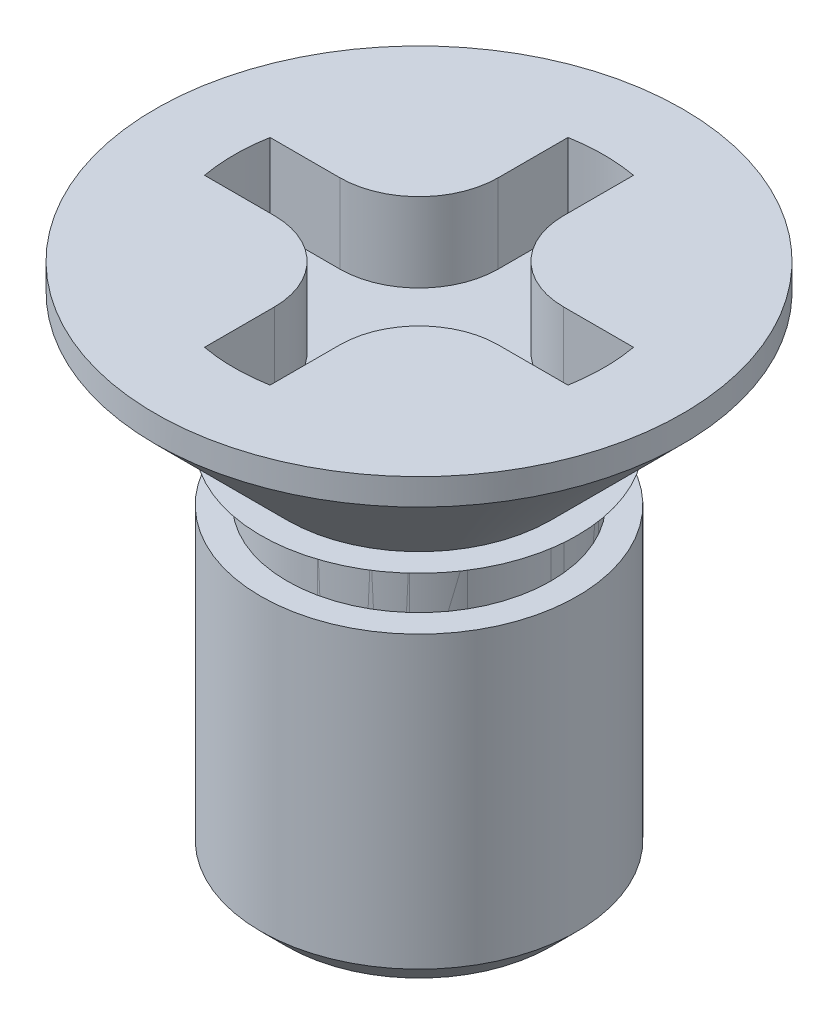
ISO-10303-21;
HEADER;
FILE_DESCRIPTION(('STEP AP214'),'2;1');
FILE_NAME('part.step','',(''),(''),'','','');
FILE_SCHEMA(('AUTOMOTIVE_DESIGN { 1 0 10303 214 1 1 1 1 }'));
ENDSEC;
DATA;
#1=APPLICATION_CONTEXT('core data for automotive mechanical design processes');
#2=APPLICATION_PROTOCOL_DEFINITION('international standard','automotive_design',2000,#1);
#3=PRODUCT_CONTEXT('',#1,'mechanical');
#4=PRODUCT('Part','Part','',(#3));
#5=PRODUCT_RELATED_PRODUCT_CATEGORY('part','',(#4));
#6=PRODUCT_DEFINITION_FORMATION('','',#4);
#7=PRODUCT_DEFINITION_CONTEXT('part definition',#1,'design');
#8=PRODUCT_DEFINITION('design','',#6,#7);
#9=PRODUCT_DEFINITION_SHAPE('','',#8);
#10=(LENGTH_UNIT() NAMED_UNIT(*) SI_UNIT(.MILLI.,.METRE.));
#11=(NAMED_UNIT(*) PLANE_ANGLE_UNIT() SI_UNIT($,.RADIAN.));
#12=(NAMED_UNIT(*) SI_UNIT($,.STERADIAN.) SOLID_ANGLE_UNIT());
#13=UNCERTAINTY_MEASURE_WITH_UNIT(LENGTH_MEASURE(1.E-05),#10,'distance_accuracy_value','');
#14=(GEOMETRIC_REPRESENTATION_CONTEXT(3) GLOBAL_UNCERTAINTY_ASSIGNED_CONTEXT((#13)) GLOBAL_UNIT_ASSIGNED_CONTEXT((#10,
#11,#12)) REPRESENTATION_CONTEXT('',''));
#15=CARTESIAN_POINT('',(0.,0.,0.));
#16=DIRECTION('',(0.,0.,1.));
#17=DIRECTION('',(1.,0.,0.));
#18=AXIS2_PLACEMENT_3D('',#15,#16,#17);
#19=CARTESIAN_POINT('',(0.,-3.5,0.));
#20=DIRECTION('',(0.,1.,0.));
#21=DIRECTION('',(0.,0.,1.));
#22=AXIS2_PLACEMENT_3D('',#19,#20,#21);
#23=CYLINDRICAL_SURFACE('',#22,1.25);
#24=CARTESIAN_POINT('',(0.,0.,0.));
#25=DIRECTION('',(0.,1.,0.));
#26=DIRECTION('',(0.,0.,1.));
#27=AXIS2_PLACEMENT_3D('',#24,#25,#26);
#28=CIRCLE('',#27,1.25);
#29=CARTESIAN_POINT('',(0.,0.,1.25));
#30=VERTEX_POINT('',#29);
#31=EDGE_CURVE('P0_E20',#30,#30,#28,.F.);
#32=ORIENTED_EDGE('',*,*,#31,.T.);
#33=EDGE_LOOP('',(#32));
#34=FACE_BOUND('',#33,.T.);
#35=CARTESIAN_POINT('',(0.,-3.5,0.));
#36=DIRECTION('',(0.,1.,0.));
#37=DIRECTION('',(0.,0.,1.));
#38=AXIS2_PLACEMENT_3D('',#35,#36,#37);
#39=CIRCLE('',#38,1.25);
#40=CARTESIAN_POINT('',(0.,-3.5,1.25));
#41=VERTEX_POINT('',#40);
#42=EDGE_CURVE('P0_E11',#41,#41,#39,.T.);
#43=ORIENTED_EDGE('',*,*,#42,.T.);
#44=EDGE_LOOP('',(#43));
#45=FACE_BOUND('',#44,.T.);
#46=ADVANCED_FACE('P0_F16',(#34,#45),#23,.T.);
#47=CARTESIAN_POINT('',(0.,0.,0.));
#48=DIRECTION('',(0.,1.,0.));
#49=DIRECTION('',(0.,0.,1.));
#50=AXIS2_PLACEMENT_3D('',#47,#48,#49);
#51=PLANE('',#50);
#52=ORIENTED_EDGE('',*,*,#31,.F.);
#53=EDGE_LOOP('',(#52));
#54=FACE_BOUND('',#53,.T.);
#55=CARTESIAN_POINT('',(-1.5,0.,0.));
#56=CARTESIAN_POINT('',(-1.5,0.,0.285847582881003));
#57=CARTESIAN_POINT('',(-1.39468245159365,0.,0.552142064342809));
#58=CARTESIAN_POINT('',(-1.28062366104029,0.,0.840538698580573));
#59=CARTESIAN_POINT('',(-1.06066017177982,0.,1.06066017177982));
#60=CARTESIAN_POINT('',(-0.841441605257595,0.,1.28003618721645));
#61=CARTESIAN_POINT('',(-0.552142064342809,0.,1.39468245159365));
#62=CARTESIAN_POINT('',(-0.286638464369077,0.,1.49989864315564));
#63=CARTESIAN_POINT('',(0.,0.,1.5));
#64=CARTESIAN_POINT('',(0.285592238421834,0.,1.50010098689345));
#65=CARTESIAN_POINT('',(0.552142064342809,0.,1.39468245159365));
#66=CARTESIAN_POINT('',(0.840538698580596,0.,1.28062366104033));
#67=CARTESIAN_POINT('',(1.06066017177982,0.,1.06066017177982));
#68=CARTESIAN_POINT('',(1.28003618721649,0.,0.841441605257491));
#69=CARTESIAN_POINT('',(1.39468245159365,0.,0.552142064342809));
#70=CARTESIAN_POINT('',(1.5,0.,0.286382699484786));
#71=CARTESIAN_POINT('',(1.5,0.,0.));
#72=B_SPLINE_CURVE_WITH_KNOTS('',2,(#55,#56,#57,#58,#59,#60,#61,#62,#63,#64,#65,#66,#67,#68,#69,
#70,#71),.UNSPECIFIED.,.F.,.F.,(3,2,2,2,2,2,2,2,3),(0.,0.125,0.25,0.375,0.5,0.625,0.75,0.875,
1.),.UNSPECIFIED.);
#73=CARTESIAN_POINT('',(-1.5,0.,0.));
#74=VERTEX_POINT('',#73);
#75=CARTESIAN_POINT('',(1.5,0.,0.));
#76=VERTEX_POINT('',#75);
#77=EDGE_CURVE('P0_E28',#74,#76,#72,.T.);
#78=ORIENTED_EDGE('',*,*,#77,.F.);
#79=CARTESIAN_POINT('',(1.5,0.,0.));
#80=CARTESIAN_POINT('',(1.5,0.,-0.285847582881003));
#81=CARTESIAN_POINT('',(1.39468245159365,0.,-0.552142064342809));
#82=CARTESIAN_POINT('',(1.28062366104029,0.,-0.840538698580573));
#83=CARTESIAN_POINT('',(1.06066017177982,0.,-1.06066017177982));
#84=CARTESIAN_POINT('',(0.841441605257595,0.,-1.28003618721645));
#85=CARTESIAN_POINT('',(0.552142064342809,0.,-1.39468245159365));
#86=CARTESIAN_POINT('',(0.286638464369077,0.,-1.49989864315564));
#87=CARTESIAN_POINT('',(0.,0.,-1.5));
#88=CARTESIAN_POINT('',(-0.285592238421834,0.,-1.50010098689345));
#89=CARTESIAN_POINT('',(-0.552142064342809,0.,-1.39468245159365));
#90=CARTESIAN_POINT('',(-0.840538698580596,0.,-1.28062366104033));
#91=CARTESIAN_POINT('',(-1.06066017177982,0.,-1.06066017177982));
#92=CARTESIAN_POINT('',(-1.28003618721649,0.,-0.841441605257491));
#93=CARTESIAN_POINT('',(-1.39468245159365,0.,-0.552142064342809));
#94=CARTESIAN_POINT('',(-1.5,0.,-0.286382699484786));
#95=CARTESIAN_POINT('',(-1.5,0.,0.));
#96=B_SPLINE_CURVE_WITH_KNOTS('',2,(#79,#80,#81,#82,#83,#84,#85,#86,#87,#88,#89,#90,#91,#92,#93,
#94,#95),.UNSPECIFIED.,.F.,.F.,(3,2,2,2,2,2,2,2,3),(0.,0.125,0.25,0.375,0.5,0.625,0.75,0.875,
1.),.UNSPECIFIED.);
#97=EDGE_CURVE('P0_E32',#76,#74,#96,.T.);
#98=ORIENTED_EDGE('',*,*,#97,.F.);
#99=EDGE_LOOP('',(#78,#98));
#100=FACE_BOUND('',#99,.T.);
#101=ADVANCED_FACE('P0_F17',(#54,#100),#51,.F.);
#102=OPEN_SHELL('',(#46,#101));
#103=SHELL_BASED_SURFACE_MODEL('P0_B1',(#102));
#104=CARTESIAN_POINT('',(0.,-3.5,0.));
#105=DIRECTION('',(0.,-1.,0.));
#106=DIRECTION('',(0.,0.,-1.));
#107=AXIS2_PLACEMENT_3D('',#104,#105,#106);
#108=PLANE('',#107);
#109=CARTESIAN_POINT('',(0.,-3.49999999997408,0.));
#110=DIRECTION('',(0.,1.,0.));
#111=DIRECTION('',(0.,0.,1.));
#112=AXIS2_PLACEMENT_3D('',#109,#110,#111);
#113=CIRCLE('',#112,1.24999999997044);
#114=CARTESIAN_POINT('',(0.,-3.49999999997408,1.24999999997044));
#115=VERTEX_POINT('',#114);
#116=EDGE_CURVE('P1_E19',#115,#115,#113,.T.);
#117=ORIENTED_EDGE('',*,*,#116,.F.);
#118=EDGE_LOOP('',(#117));
#119=FACE_BOUND('',#118,.T.);
#120=ADVANCED_FACE('P1_F16',(#119),#108,.T.);
#121=CARTESIAN_POINT('',(0.,-3.25000000009368,0.));
#122=DIRECTION('',(0.,1.,0.));
#123=DIRECTION('',(0.,0.,1.));
#124=AXIS2_PLACEMENT_3D('',#121,#122,#123);
#125=CONICAL_SURFACE('',#124,1.49999999990769,0.785398163511135);
#126=CARTESIAN_POINT('',(0.,-3.25,0.));
#127=DIRECTION('',(0.,-1.,0.));
#128=DIRECTION('',(0.,0.,-1.));
#129=AXIS2_PLACEMENT_3D('',#126,#127,#128);
#130=CIRCLE('',#129,1.5);
#131=CARTESIAN_POINT('',(0.,-3.25,-1.5));
#132=VERTEX_POINT('',#131);
#133=EDGE_CURVE('P1_E188',#132,#132,#130,.F.);
#134=ORIENTED_EDGE('',*,*,#133,.F.);
#135=EDGE_LOOP('',(#134));
#136=FACE_BOUND('',#135,.T.);
#137=ORIENTED_EDGE('',*,*,#116,.T.);
#138=EDGE_LOOP('',(#137));
#139=FACE_BOUND('',#138,.T.);
#140=ADVANCED_FACE('P1_F243',(#136,#139),#125,.T.);
#141=CARTESIAN_POINT('',(0.,1.75,0.));
#142=DIRECTION('',(0.,-1.,0.));
#143=DIRECTION('',(0.,0.,-1.));
#144=AXIS2_PLACEMENT_3D('',#141,#142,#143);
#145=CYLINDRICAL_SURFACE('',#144,1.5);
#146=ORIENTED_EDGE('',*,*,#133,.T.);
#147=EDGE_LOOP('',(#146));
#148=FACE_BOUND('',#147,.T.);
#149=CARTESIAN_POINT('',(0.,-0.5,0.));
#150=DIRECTION('',(0.,-1.,0.));
#151=DIRECTION('',(0.,0.,-1.));
#152=AXIS2_PLACEMENT_3D('',#149,#150,#151);
#153=CIRCLE('',#152,1.5);
#154=CARTESIAN_POINT('',(0.,-0.5,-1.5));
#155=VERTEX_POINT('',#154);
#156=EDGE_CURVE('P1_E190',#155,#155,#153,.F.);
#157=ORIENTED_EDGE('',*,*,#156,.F.);
#158=EDGE_LOOP('',(#157));
#159=FACE_BOUND('',#158,.T.);
#160=ADVANCED_FACE('P1_F241',(#148,#159),#145,.T.);
#161=CARTESIAN_POINT('',(0.,-0.5,0.));
#162=DIRECTION('',(0.,1.,0.));
#163=DIRECTION('',(0.,0.,1.));
#164=AXIS2_PLACEMENT_3D('',#161,#162,#163);
#165=PLANE('',#164);
#166=CARTESIAN_POINT('',(0.,-0.5,0.));
#167=DIRECTION('',(0.,1.,0.));
#168=DIRECTION('',(0.,0.,1.));
#169=AXIS2_PLACEMENT_3D('',#166,#167,#168);
#170=CIRCLE('',#169,1.25);
#171=CARTESIAN_POINT('',(0.,-0.5,1.25));
#172=VERTEX_POINT('',#171);
#173=EDGE_CURVE('P1_E187',#172,#172,#170,.T.);
#174=ORIENTED_EDGE('',*,*,#173,.F.);
#175=EDGE_LOOP('',(#174));
#176=FACE_BOUND('',#175,.T.);
#177=ORIENTED_EDGE('',*,*,#156,.T.);
#178=EDGE_LOOP('',(#177));
#179=FACE_BOUND('',#178,.T.);
#180=ADVANCED_FACE('P1_F239',(#176,#179),#165,.T.);
#181=CARTESIAN_POINT('',(0.,-0.6,0.));
#182=DIRECTION('',(0.,1.,0.));
#183=DIRECTION('',(0.,0.,1.));
#184=AXIS2_PLACEMENT_3D('',#181,#182,#183);
#185=CYLINDRICAL_SURFACE('',#184,1.25);
#186=ORIENTED_EDGE('',*,*,#173,.T.);
#187=EDGE_LOOP('',(#186));
#188=FACE_BOUND('',#187,.T.);
#189=CARTESIAN_POINT('',(0.,0.,0.));
#190=DIRECTION('',(0.,1.,0.));
#191=DIRECTION('',(1.,0.,0.));
#192=AXIS2_PLACEMENT_3D('',#189,#190,#191);
#193=CIRCLE('',#192,1.24999999997044);
#194=CARTESIAN_POINT('',(1.24999999997044,0.,0.));
#195=VERTEX_POINT('',#194);
#196=EDGE_CURVE('P1_E184',#195,#195,#193,.T.);
#197=ORIENTED_EDGE('',*,*,#196,.F.);
#198=EDGE_LOOP('',(#197));
#199=FACE_BOUND('',#198,.T.);
#200=ADVANCED_FACE('P1_F251',(#188,#199),#185,.T.);
#201=CARTESIAN_POINT('',(0.,1.2499999999136,0.));
#202=DIRECTION('',(0.,1.,0.));
#203=DIRECTION('',(0.,0.,1.));
#204=AXIS2_PLACEMENT_3D('',#201,#202,#203);
#205=CONICAL_SURFACE('',#204,2.49999999988404,0.785398163397448);
#206=ORIENTED_EDGE('',*,*,#196,.T.);
#207=EDGE_LOOP('',(#206));
#208=FACE_BOUND('',#207,.T.);
#209=CARTESIAN_POINT('',(0.,1.25,0.));
#210=DIRECTION('',(0.,-1.,0.));
#211=DIRECTION('',(0.,0.,-1.));
#212=AXIS2_PLACEMENT_3D('',#209,#210,#211);
#213=CIRCLE('',#212,2.5);
#214=CARTESIAN_POINT('',(0.,1.25,-2.5));
#215=VERTEX_POINT('',#214);
#216=EDGE_CURVE('P1_E144',#215,#215,#213,.F.);
#217=ORIENTED_EDGE('',*,*,#216,.F.);
#218=EDGE_LOOP('',(#217));
#219=FACE_BOUND('',#218,.T.);
#220=ADVANCED_FACE('P1_F329',(#208,#219),#205,.T.);
#221=CARTESIAN_POINT('',(0.,0.75,0.));
#222=DIRECTION('',(0.,-1.,0.));
#223=DIRECTION('',(0.,0.,-1.));
#224=AXIS2_PLACEMENT_3D('',#221,#222,#223);
#225=PLANE('',#224);
#226=DIRECTION('',(0.,0.,1.));
#227=VECTOR('',#226,1.);
#228=CARTESIAN_POINT('',(-0.3106601717798,0.75,1.722205056801));
#229=LINE('',#228,#227);
#230=CARTESIAN_POINT('',(-0.3106601717798,0.75,1.06066017178));
#231=VERTEX_POINT('',#230);
#232=CARTESIAN_POINT('',(-0.31066017177977,0.75,1.72220505680066));
#233=VERTEX_POINT('',#232);
#234=EDGE_CURVE('P1_E150',#231,#233,#229,.T.);
#235=ORIENTED_EDGE('',*,*,#234,.T.);
#236=CARTESIAN_POINT('',(0.,0.75,0.));
#237=DIRECTION('',(0.,-1.,0.));
#238=DIRECTION('',(0.,0.,-1.));
#239=AXIS2_PLACEMENT_3D('',#236,#237,#238);
#240=CIRCLE('',#239,1.75);
#241=CARTESIAN_POINT('',(0.3106601717798,0.75,1.72220505680083));
#242=VERTEX_POINT('',#241);
#243=EDGE_CURVE('P1_E233',#233,#242,#240,.F.);
#244=ORIENTED_EDGE('',*,*,#243,.T.);
#245=DIRECTION('',(0.,0.,-1.));
#246=VECTOR('',#245,1.);
#247=CARTESIAN_POINT('',(0.3106601717798,0.75,1.06066017178));
#248=LINE('',#247,#246);
#249=CARTESIAN_POINT('',(0.3106601717799,0.75,1.06066017178));
#250=VERTEX_POINT('',#249);
#251=EDGE_CURVE('P1_E175',#242,#250,#248,.T.);
#252=ORIENTED_EDGE('',*,*,#251,.T.);
#253=CARTESIAN_POINT('',(1.06066017178,0.75,1.06066017178));
#254=DIRECTION('',(0.,-1.,0.));
#255=DIRECTION('',(0.,0.,-1.));
#256=AXIS2_PLACEMENT_3D('',#253,#254,#255);
#257=CIRCLE('',#256,0.75);
#258=CARTESIAN_POINT('',(1.06066017178,0.75,0.3106601717798));
#259=VERTEX_POINT('',#258);
#260=EDGE_CURVE('P1_E178',#259,#250,#257,.F.);
#261=ORIENTED_EDGE('',*,*,#260,.F.);
#262=DIRECTION('',(1.,0.,0.));
#263=VECTOR('',#262,1.);
#264=CARTESIAN_POINT('',(1.722205056801,0.75,0.3106601717798));
#265=LINE('',#264,#263);
#266=CARTESIAN_POINT('',(1.72220505680066,0.75,0.31066017177977));
#267=VERTEX_POINT('',#266);
#268=EDGE_CURVE('P1_E171',#259,#267,#265,.T.);
#269=ORIENTED_EDGE('',*,*,#268,.T.);
#270=CARTESIAN_POINT('',(0.,0.75,0.));
#271=DIRECTION('',(0.,-1.,0.));
#272=DIRECTION('',(0.,0.,-1.));
#273=AXIS2_PLACEMENT_3D('',#270,#271,#272);
#274=CIRCLE('',#273,1.75);
#275=CARTESIAN_POINT('',(1.72220505680083,0.75,-0.3106601717798));
#276=VERTEX_POINT('',#275);
#277=EDGE_CURVE('P1_E229',#267,#276,#274,.F.);
#278=ORIENTED_EDGE('',*,*,#277,.T.);
#279=DIRECTION('',(-1.,0.,0.));
#280=VECTOR('',#279,1.);
#281=CARTESIAN_POINT('',(1.06066017178,0.75,-0.3106601717798));
#282=LINE('',#281,#280);
#283=CARTESIAN_POINT('',(1.06066017178,0.75,-0.3106601717799));
#284=VERTEX_POINT('',#283);
#285=EDGE_CURVE('P1_E166',#276,#284,#282,.T.);
#286=ORIENTED_EDGE('',*,*,#285,.T.);
#287=CARTESIAN_POINT('',(1.06066017178,0.75,-1.06066017178));
#288=DIRECTION('',(0.,-1.,0.));
#289=DIRECTION('',(0.,0.,-1.));
#290=AXIS2_PLACEMENT_3D('',#287,#288,#289);
#291=CIRCLE('',#290,0.75);
#292=CARTESIAN_POINT('',(0.3106601717798,0.75,-1.06066017178));
#293=VERTEX_POINT('',#292);
#294=EDGE_CURVE('P1_E169',#293,#284,#291,.F.);
#295=ORIENTED_EDGE('',*,*,#294,.F.);
#296=DIRECTION('',(0.,0.,-1.));
#297=VECTOR('',#296,1.);
#298=CARTESIAN_POINT('',(0.3106601717798,0.75,-1.722205056801));
#299=LINE('',#298,#297);
#300=CARTESIAN_POINT('',(0.31066017177977,0.75,-1.72220505680066));
#301=VERTEX_POINT('',#300);
#302=EDGE_CURVE('P1_E162',#293,#301,#299,.T.);
#303=ORIENTED_EDGE('',*,*,#302,.T.);
#304=CARTESIAN_POINT('',(0.,0.75,0.));
#305=DIRECTION('',(0.,-1.,0.));
#306=DIRECTION('',(0.,0.,-1.));
#307=AXIS2_PLACEMENT_3D('',#304,#305,#306);
#308=CIRCLE('',#307,1.75);
#309=CARTESIAN_POINT('',(-0.3106601717798,0.75,-1.72220505680083));
#310=VERTEX_POINT('',#309);
#311=EDGE_CURVE('P1_E225',#301,#310,#308,.F.);
#312=ORIENTED_EDGE('',*,*,#311,.T.);
#313=DIRECTION('',(0.,0.,1.));
#314=VECTOR('',#313,1.);
#315=CARTESIAN_POINT('',(-0.3106601717798,0.75,-1.06066017178));
#316=LINE('',#315,#314);
#317=CARTESIAN_POINT('',(-0.3106601717799,0.75,-1.06066017178));
#318=VERTEX_POINT('',#317);
#319=EDGE_CURVE('P1_E157',#310,#318,#316,.T.);
#320=ORIENTED_EDGE('',*,*,#319,.T.);
#321=CARTESIAN_POINT('',(-1.06066017178,0.75,-1.06066017178));
#322=DIRECTION('',(0.,-1.,0.));
#323=DIRECTION('',(0.,0.,-1.));
#324=AXIS2_PLACEMENT_3D('',#321,#322,#323);
#325=CIRCLE('',#324,0.75);
#326=CARTESIAN_POINT('',(-1.06066017178,0.75,-0.3106601717798));
#327=VERTEX_POINT('',#326);
#328=EDGE_CURVE('P1_E160',#327,#318,#325,.F.);
#329=ORIENTED_EDGE('',*,*,#328,.F.);
#330=DIRECTION('',(-1.,0.,0.));
#331=VECTOR('',#330,1.);
#332=CARTESIAN_POINT('',(-1.722205056801,0.75,-0.3106601717798));
#333=LINE('',#332,#331);
#334=CARTESIAN_POINT('',(-1.72220505680066,0.75,-0.31066017177977));
#335=VERTEX_POINT('',#334);
#336=EDGE_CURVE('P1_E154',#327,#335,#333,.T.);
#337=ORIENTED_EDGE('',*,*,#336,.T.);
#338=CARTESIAN_POINT('',(0.,0.75,0.));
#339=DIRECTION('',(0.,-1.,0.));
#340=DIRECTION('',(0.,0.,-1.));
#341=AXIS2_PLACEMENT_3D('',#338,#339,#340);
#342=CIRCLE('',#341,1.75);
#343=CARTESIAN_POINT('',(-1.72220505680066,0.75,0.31066017177977));
#344=VERTEX_POINT('',#343);
#345=EDGE_CURVE('P1_E140',#335,#344,#342,.F.);
#346=ORIENTED_EDGE('',*,*,#345,.T.);
#347=DIRECTION('',(1.,0.,0.));
#348=VECTOR('',#347,1.);
#349=CARTESIAN_POINT('',(-1.06066017178,0.75,0.3106601717798));
#350=LINE('',#349,#348);
#351=CARTESIAN_POINT('',(-1.06066017178,0.75,0.3106601717799));
#352=VERTEX_POINT('',#351);
#353=EDGE_CURVE('P1_E136',#344,#352,#350,.T.);
#354=ORIENTED_EDGE('',*,*,#353,.T.);
#355=CARTESIAN_POINT('',(-1.06066017178,0.75,1.06066017178));
#356=DIRECTION('',(0.,-1.,0.));
#357=DIRECTION('',(0.,0.,-1.));
#358=AXIS2_PLACEMENT_3D('',#355,#356,#357);
#359=CIRCLE('',#358,0.75);
#360=EDGE_CURVE('P1_E126',#231,#352,#359,.F.);
#361=ORIENTED_EDGE('',*,*,#360,.F.);
#362=EDGE_LOOP('',(#235,#244,#252,#261,#269,#278,#286,#295,#303,#312,#320,#329,#337,#346,#354,#361));
#363=FACE_BOUND('',#362,.T.);
#364=ADVANCED_FACE('P1_F139',(#363),#225,.F.);
#365=CARTESIAN_POINT('',(0.,1.75,0.));
#366=DIRECTION('',(0.,-1.,0.));
#367=DIRECTION('',(0.,0.,-1.));
#368=AXIS2_PLACEMENT_3D('',#365,#366,#367);
#369=CYLINDRICAL_SURFACE('',#368,2.5);
#370=CARTESIAN_POINT('',(0.,1.5,0.));
#371=DIRECTION('',(0.,-1.,0.));
#372=DIRECTION('',(0.,0.,-1.));
#373=AXIS2_PLACEMENT_3D('',#370,#371,#372);
#374=CIRCLE('',#373,2.5);
#375=CARTESIAN_POINT('',(0.,1.5,-2.5));
#376=VERTEX_POINT('',#375);
#377=EDGE_CURVE('P1_E218',#376,#376,#374,.T.);
#378=ORIENTED_EDGE('',*,*,#377,.T.);
#379=EDGE_LOOP('',(#378));
#380=FACE_BOUND('',#379,.T.);
#381=ORIENTED_EDGE('',*,*,#216,.T.);
#382=EDGE_LOOP('',(#381));
#383=FACE_BOUND('',#382,.T.);
#384=ADVANCED_FACE('P1_F323',(#380,#383),#369,.T.);
#385=CARTESIAN_POINT('',(-1.06066017178,0.75,0.3106601717798));
#386=DIRECTION('',(0.,0.,1.));
#387=DIRECTION('',(1.,0.,0.));
#388=AXIS2_PLACEMENT_3D('',#385,#386,#387);
#389=PLANE('',#388);
#390=ORIENTED_EDGE('',*,*,#353,.F.);
#391=DIRECTION('',(0.,-1.,0.));
#392=VECTOR('',#391,1.);
#393=CARTESIAN_POINT('',(-1.72220505680067,0.75,0.310660171779741));
#394=LINE('',#393,#392);
#395=CARTESIAN_POINT('',(-1.72220505680066,1.5,0.31066017177977));
#396=VERTEX_POINT('',#395);
#397=EDGE_CURVE('P1_E221',#344,#396,#394,.F.);
#398=ORIENTED_EDGE('',*,*,#397,.T.);
#399=DIRECTION('',(1.,0.,0.));
#400=VECTOR('',#399,1.);
#401=CARTESIAN_POINT('',(0.,1.5,0.3106601717798));
#402=LINE('',#401,#400);
#403=CARTESIAN_POINT('',(-1.06066017178,1.5,0.3106601717799));
#404=VERTEX_POINT('',#403);
#405=EDGE_CURVE('P1_E148',#396,#404,#402,.T.);
#406=ORIENTED_EDGE('',*,*,#405,.T.);
#407=DIRECTION('',(0.,-1.,0.));
#408=VECTOR('',#407,1.);
#409=CARTESIAN_POINT('',(-1.06066017178,0.75,0.31066017178));
#410=LINE('',#409,#408);
#411=EDGE_CURVE('P1_E133',#352,#404,#410,.F.);
#412=ORIENTED_EDGE('',*,*,#411,.F.);
#413=EDGE_LOOP('',(#390,#398,#406,#412));
#414=FACE_BOUND('',#413,.T.);
#415=ADVANCED_FACE('P1_F147',(#414),#389,.F.);
#416=CARTESIAN_POINT('',(-1.06066017178,0.75,1.06066017178));
#417=DIRECTION('',(0.,-1.,0.));
#418=DIRECTION('',(0.,0.,-1.));
#419=AXIS2_PLACEMENT_3D('',#416,#417,#418);
#420=CYLINDRICAL_SURFACE('',#419,0.75);
#421=ORIENTED_EDGE('',*,*,#411,.T.);
#422=CARTESIAN_POINT('',(-1.06066017178,1.5,1.06066017178));
#423=DIRECTION('',(0.,-1.,0.));
#424=DIRECTION('',(0.,0.,-1.));
#425=AXIS2_PLACEMENT_3D('',#422,#423,#424);
#426=CIRCLE('',#425,0.75);
#427=CARTESIAN_POINT('',(-0.3106601717798,1.5,1.06066017178));
#428=VERTEX_POINT('',#427);
#429=EDGE_CURVE('P1_E216',#404,#428,#426,.T.);
#430=ORIENTED_EDGE('',*,*,#429,.T.);
#431=DIRECTION('',(0.,1.,0.));
#432=VECTOR('',#431,1.);
#433=CARTESIAN_POINT('',(-0.3106601717798,0.75,1.06066017178));
#434=LINE('',#433,#432);
#435=EDGE_CURVE('P1_E135',#428,#231,#434,.F.);
#436=ORIENTED_EDGE('',*,*,#435,.T.);
#437=ORIENTED_EDGE('',*,*,#360,.T.);
#438=EDGE_LOOP('',(#421,#430,#436,#437));
#439=FACE_BOUND('',#438,.T.);
#440=ADVANCED_FACE('P1_F130',(#439),#420,.T.);
#441=CARTESIAN_POINT('',(-0.3106601717798,0.75,1.722205056801));
#442=DIRECTION('',(-1.,0.,0.));
#443=DIRECTION('',(0.,0.,1.));
#444=AXIS2_PLACEMENT_3D('',#441,#442,#443);
#445=PLANE('',#444);
#446=ORIENTED_EDGE('',*,*,#234,.F.);
#447=ORIENTED_EDGE('',*,*,#435,.F.);
#448=DIRECTION('',(0.,0.,-1.));
#449=VECTOR('',#448,1.);
#450=CARTESIAN_POINT('',(-0.3106601717798,1.5,0.));
#451=LINE('',#450,#449);
#452=CARTESIAN_POINT('',(-0.31066017177977,1.5,1.72220505680066));
#453=VERTEX_POINT('',#452);
#454=EDGE_CURVE('P1_E215',#428,#453,#451,.F.);
#455=ORIENTED_EDGE('',*,*,#454,.T.);
#456=DIRECTION('',(0.,-1.,0.));
#457=VECTOR('',#456,1.);
#458=CARTESIAN_POINT('',(-0.310660171779739,0.75,1.72220505680067));
#459=LINE('',#458,#457);
#460=EDGE_CURVE('P1_E181',#453,#233,#459,.T.);
#461=ORIENTED_EDGE('',*,*,#460,.T.);
#462=EDGE_LOOP('',(#446,#447,#455,#461));
#463=FACE_BOUND('',#462,.T.);
#464=ADVANCED_FACE('P1_F314',(#463),#445,.F.);
#465=CARTESIAN_POINT('',(0.,0.75,0.));
#466=DIRECTION('',(0.,-1.,0.));
#467=DIRECTION('',(0.,0.,-1.));
#468=AXIS2_PLACEMENT_3D('',#465,#466,#467);
#469=CYLINDRICAL_SURFACE('',#468,1.75);
#470=ORIENTED_EDGE('',*,*,#243,.F.);
#471=ORIENTED_EDGE('',*,*,#460,.F.);
#472=CARTESIAN_POINT('',(0.,1.5,0.));
#473=DIRECTION('',(0.,-1.,0.));
#474=DIRECTION('',(0.,0.,-1.));
#475=AXIS2_PLACEMENT_3D('',#472,#473,#474);
#476=CIRCLE('',#475,1.75);
#477=CARTESIAN_POINT('',(0.3106601717798,1.5,1.72220505680083));
#478=VERTEX_POINT('',#477);
#479=EDGE_CURVE('P1_E212',#453,#478,#476,.F.);
#480=ORIENTED_EDGE('',*,*,#479,.T.);
#481=DIRECTION('',(0.,1.,0.));
#482=VECTOR('',#481,1.);
#483=CARTESIAN_POINT('',(0.3106601717798,0.75,1.722205056801));
#484=LINE('',#483,#482);
#485=EDGE_CURVE('P1_E179',#478,#242,#484,.F.);
#486=ORIENTED_EDGE('',*,*,#485,.T.);
#487=EDGE_LOOP('',(#470,#471,#480,#486));
#488=FACE_BOUND('',#487,.T.);
#489=ADVANCED_FACE('P1_F310',(#488),#469,.F.);
#490=CARTESIAN_POINT('',(0.3106601717798,0.75,1.06066017178));
#491=DIRECTION('',(1.,0.,0.));
#492=DIRECTION('',(0.,0.,-1.));
#493=AXIS2_PLACEMENT_3D('',#490,#491,#492);
#494=PLANE('',#493);
#495=ORIENTED_EDGE('',*,*,#251,.F.);
#496=ORIENTED_EDGE('',*,*,#485,.F.);
#497=DIRECTION('',(0.,0.,-1.));
#498=VECTOR('',#497,1.);
#499=CARTESIAN_POINT('',(0.3106601717798,1.5,0.));
#500=LINE('',#499,#498);
#501=CARTESIAN_POINT('',(0.3106601717799,1.5,1.06066017178));
#502=VERTEX_POINT('',#501);
#503=EDGE_CURVE('P1_E211',#478,#502,#500,.T.);
#504=ORIENTED_EDGE('',*,*,#503,.T.);
#505=DIRECTION('',(0.,-1.,0.));
#506=VECTOR('',#505,1.);
#507=CARTESIAN_POINT('',(0.31066017178,0.75,1.06066017178));
#508=LINE('',#507,#506);
#509=EDGE_CURVE('P1_E232',#250,#502,#508,.F.);
#510=ORIENTED_EDGE('',*,*,#509,.F.);
#511=EDGE_LOOP('',(#495,#496,#504,#510));
#512=FACE_BOUND('',#511,.T.);
#513=ADVANCED_FACE('P1_F306',(#512),#494,.F.);
#514=CARTESIAN_POINT('',(1.06066017178,0.75,1.06066017178));
#515=DIRECTION('',(0.,-1.,0.));
#516=DIRECTION('',(0.,0.,-1.));
#517=AXIS2_PLACEMENT_3D('',#514,#515,#516);
#518=CYLINDRICAL_SURFACE('',#517,0.75);
#519=ORIENTED_EDGE('',*,*,#509,.T.);
#520=CARTESIAN_POINT('',(1.06066017178,1.5,1.06066017178));
#521=DIRECTION('',(0.,-1.,0.));
#522=DIRECTION('',(0.,0.,-1.));
#523=AXIS2_PLACEMENT_3D('',#520,#521,#522);
#524=CIRCLE('',#523,0.75);
#525=CARTESIAN_POINT('',(1.06066017178,1.5,0.3106601717798));
#526=VERTEX_POINT('',#525);
#527=EDGE_CURVE('P1_E208',#502,#526,#524,.T.);
#528=ORIENTED_EDGE('',*,*,#527,.T.);
#529=DIRECTION('',(0.,1.,0.));
#530=VECTOR('',#529,1.);
#531=CARTESIAN_POINT('',(1.06066017178,0.75,0.3106601717798));
#532=LINE('',#531,#530);
#533=EDGE_CURVE('P1_E174',#526,#259,#532,.F.);
#534=ORIENTED_EDGE('',*,*,#533,.T.);
#535=ORIENTED_EDGE('',*,*,#260,.T.);
#536=EDGE_LOOP('',(#519,#528,#534,#535));
#537=FACE_BOUND('',#536,.T.);
#538=ADVANCED_FACE('P1_F302',(#537),#518,.T.);
#539=CARTESIAN_POINT('',(1.722205056801,0.75,0.3106601717798));
#540=DIRECTION('',(0.,0.,1.));
#541=DIRECTION('',(1.,0.,0.));
#542=AXIS2_PLACEMENT_3D('',#539,#540,#541);
#543=PLANE('',#542);
#544=ORIENTED_EDGE('',*,*,#268,.F.);
#545=ORIENTED_EDGE('',*,*,#533,.F.);
#546=DIRECTION('',(1.,0.,0.));
#547=VECTOR('',#546,1.);
#548=CARTESIAN_POINT('',(0.,1.5,0.3106601717798));
#549=LINE('',#548,#547);
#550=CARTESIAN_POINT('',(1.72220505680066,1.5,0.31066017177977));
#551=VERTEX_POINT('',#550);
#552=EDGE_CURVE('P1_E207',#526,#551,#549,.T.);
#553=ORIENTED_EDGE('',*,*,#552,.T.);
#554=DIRECTION('',(0.,-1.,0.));
#555=VECTOR('',#554,1.);
#556=CARTESIAN_POINT('',(1.72220505680067,0.75,0.31066017177974));
#557=LINE('',#556,#555);
#558=EDGE_CURVE('P1_E173',#551,#267,#557,.T.);
#559=ORIENTED_EDGE('',*,*,#558,.T.);
#560=EDGE_LOOP('',(#544,#545,#553,#559));
#561=FACE_BOUND('',#560,.T.);
#562=ADVANCED_FACE('P1_F298',(#561),#543,.F.);
#563=CARTESIAN_POINT('',(0.,0.75,0.));
#564=DIRECTION('',(0.,-1.,0.));
#565=DIRECTION('',(0.,0.,-1.));
#566=AXIS2_PLACEMENT_3D('',#563,#564,#565);
#567=CYLINDRICAL_SURFACE('',#566,1.75);
#568=ORIENTED_EDGE('',*,*,#277,.F.);
#569=ORIENTED_EDGE('',*,*,#558,.F.);
#570=CARTESIAN_POINT('',(0.,1.5,0.));
#571=DIRECTION('',(0.,-1.,0.));
#572=DIRECTION('',(0.,0.,-1.));
#573=AXIS2_PLACEMENT_3D('',#570,#571,#572);
#574=CIRCLE('',#573,1.75);
#575=CARTESIAN_POINT('',(1.72220505680083,1.5,-0.3106601717798));
#576=VERTEX_POINT('',#575);
#577=EDGE_CURVE('P1_E204',#551,#576,#574,.F.);
#578=ORIENTED_EDGE('',*,*,#577,.T.);
#579=DIRECTION('',(0.,1.,0.));
#580=VECTOR('',#579,1.);
#581=CARTESIAN_POINT('',(1.722205056801,0.75,-0.3106601717798));
#582=LINE('',#581,#580);
#583=EDGE_CURVE('P1_E170',#576,#276,#582,.F.);
#584=ORIENTED_EDGE('',*,*,#583,.T.);
#585=EDGE_LOOP('',(#568,#569,#578,#584));
#586=FACE_BOUND('',#585,.T.);
#587=ADVANCED_FACE('P1_F294',(#586),#567,.F.);
#588=CARTESIAN_POINT('',(1.06066017178,0.75,-0.3106601717798));
#589=DIRECTION('',(0.,0.,-1.));
#590=DIRECTION('',(-1.,0.,0.));
#591=AXIS2_PLACEMENT_3D('',#588,#589,#590);
#592=PLANE('',#591);
#593=ORIENTED_EDGE('',*,*,#583,.F.);
#594=DIRECTION('',(1.,0.,0.));
#595=VECTOR('',#594,1.);
#596=CARTESIAN_POINT('',(0.,1.5,-0.3106601717798));
#597=LINE('',#596,#595);
#598=CARTESIAN_POINT('',(1.06066017178,1.5,-0.3106601717799));
#599=VERTEX_POINT('',#598);
#600=EDGE_CURVE('P1_E203',#576,#599,#597,.F.);
#601=ORIENTED_EDGE('',*,*,#600,.T.);
#602=DIRECTION('',(0.,-1.,0.));
#603=VECTOR('',#602,1.);
#604=CARTESIAN_POINT('',(1.06066017178,0.75,-0.31066017178));
#605=LINE('',#604,#603);
#606=EDGE_CURVE('P1_E228',#284,#599,#605,.F.);
#607=ORIENTED_EDGE('',*,*,#606,.F.);
#608=ORIENTED_EDGE('',*,*,#285,.F.);
#609=EDGE_LOOP('',(#593,#601,#607,#608));
#610=FACE_BOUND('',#609,.T.);
#611=ADVANCED_FACE('P1_F290',(#610),#592,.F.);
#612=CARTESIAN_POINT('',(1.06066017178,0.75,-1.06066017178));
#613=DIRECTION('',(0.,-1.,0.));
#614=DIRECTION('',(0.,0.,-1.));
#615=AXIS2_PLACEMENT_3D('',#612,#613,#614);
#616=CYLINDRICAL_SURFACE('',#615,0.75);
#617=CARTESIAN_POINT('',(1.06066017178,1.5,-1.06066017178));
#618=DIRECTION('',(0.,-1.,0.));
#619=DIRECTION('',(0.,0.,-1.));
#620=AXIS2_PLACEMENT_3D('',#617,#618,#619);
#621=CIRCLE('',#620,0.75);
#622=CARTESIAN_POINT('',(0.3106601717798,1.5,-1.06066017178));
#623=VERTEX_POINT('',#622);
#624=EDGE_CURVE('P1_E200',#599,#623,#621,.T.);
#625=ORIENTED_EDGE('',*,*,#624,.T.);
#626=DIRECTION('',(0.,1.,0.));
#627=VECTOR('',#626,1.);
#628=CARTESIAN_POINT('',(0.3106601717798,0.75,-1.06066017178));
#629=LINE('',#628,#627);
#630=EDGE_CURVE('P1_E165',#623,#293,#629,.F.);
#631=ORIENTED_EDGE('',*,*,#630,.T.);
#632=ORIENTED_EDGE('',*,*,#294,.T.);
#633=ORIENTED_EDGE('',*,*,#606,.T.);
#634=EDGE_LOOP('',(#625,#631,#632,#633));
#635=FACE_BOUND('',#634,.T.);
#636=ADVANCED_FACE('P1_F286',(#635),#616,.T.);
#637=CARTESIAN_POINT('',(0.3106601717798,0.75,-1.722205056801));
#638=DIRECTION('',(1.,0.,0.));
#639=DIRECTION('',(0.,0.,-1.));
#640=AXIS2_PLACEMENT_3D('',#637,#638,#639);
#641=PLANE('',#640);
#642=ORIENTED_EDGE('',*,*,#630,.F.);
#643=DIRECTION('',(0.,0.,-1.));
#644=VECTOR('',#643,1.);
#645=CARTESIAN_POINT('',(0.3106601717798,1.5,0.));
#646=LINE('',#645,#644);
#647=CARTESIAN_POINT('',(0.31066017177977,1.5,-1.72220505680066));
#648=VERTEX_POINT('',#647);
#649=EDGE_CURVE('P1_E199',#623,#648,#646,.T.);
#650=ORIENTED_EDGE('',*,*,#649,.T.);
#651=DIRECTION('',(0.,-1.,0.));
#652=VECTOR('',#651,1.);
#653=CARTESIAN_POINT('',(0.31066017177974,0.75,-1.72220505680067));
#654=LINE('',#653,#652);
#655=EDGE_CURVE('P1_E164',#648,#301,#654,.T.);
#656=ORIENTED_EDGE('',*,*,#655,.T.);
#657=ORIENTED_EDGE('',*,*,#302,.F.);
#658=EDGE_LOOP('',(#642,#650,#656,#657));
#659=FACE_BOUND('',#658,.T.);
#660=ADVANCED_FACE('P1_F282',(#659),#641,.F.);
#661=CARTESIAN_POINT('',(0.,0.75,0.));
#662=DIRECTION('',(0.,-1.,0.));
#663=DIRECTION('',(0.,0.,-1.));
#664=AXIS2_PLACEMENT_3D('',#661,#662,#663);
#665=CYLINDRICAL_SURFACE('',#664,1.75);
#666=ORIENTED_EDGE('',*,*,#655,.F.);
#667=CARTESIAN_POINT('',(0.,1.5,0.));
#668=DIRECTION('',(0.,-1.,0.));
#669=DIRECTION('',(0.,0.,-1.));
#670=AXIS2_PLACEMENT_3D('',#667,#668,#669);
#671=CIRCLE('',#670,1.75);
#672=CARTESIAN_POINT('',(-0.3106601717798,1.5,-1.72220505680083));
#673=VERTEX_POINT('',#672);
#674=EDGE_CURVE('P1_E196',#648,#673,#671,.F.);
#675=ORIENTED_EDGE('',*,*,#674,.T.);
#676=DIRECTION('',(0.,1.,0.));
#677=VECTOR('',#676,1.);
#678=CARTESIAN_POINT('',(-0.3106601717798,0.75,-1.722205056801));
#679=LINE('',#678,#677);
#680=EDGE_CURVE('P1_E161',#673,#310,#679,.F.);
#681=ORIENTED_EDGE('',*,*,#680,.T.);
#682=ORIENTED_EDGE('',*,*,#311,.F.);
#683=EDGE_LOOP('',(#666,#675,#681,#682));
#684=FACE_BOUND('',#683,.T.);
#685=ADVANCED_FACE('P1_F278',(#684),#665,.F.);
#686=CARTESIAN_POINT('',(-0.3106601717798,0.75,-1.06066017178));
#687=DIRECTION('',(-1.,0.,0.));
#688=DIRECTION('',(0.,0.,1.));
#689=AXIS2_PLACEMENT_3D('',#686,#687,#688);
#690=PLANE('',#689);
#691=ORIENTED_EDGE('',*,*,#680,.F.);
#692=DIRECTION('',(0.,0.,-1.));
#693=VECTOR('',#692,1.);
#694=CARTESIAN_POINT('',(-0.3106601717798,1.5,0.));
#695=LINE('',#694,#693);
#696=CARTESIAN_POINT('',(-0.3106601717799,1.5,-1.06066017178));
#697=VERTEX_POINT('',#696);
#698=EDGE_CURVE('P1_E195',#673,#697,#695,.F.);
#699=ORIENTED_EDGE('',*,*,#698,.T.);
#700=DIRECTION('',(0.,-1.,0.));
#701=VECTOR('',#700,1.);
#702=CARTESIAN_POINT('',(-0.31066017178,0.75,-1.06066017178));
#703=LINE('',#702,#701);
#704=EDGE_CURVE('P1_E224',#318,#697,#703,.F.);
#705=ORIENTED_EDGE('',*,*,#704,.F.);
#706=ORIENTED_EDGE('',*,*,#319,.F.);
#707=EDGE_LOOP('',(#691,#699,#705,#706));
#708=FACE_BOUND('',#707,.T.);
#709=ADVANCED_FACE('P1_F274',(#708),#690,.F.);
#710=CARTESIAN_POINT('',(-1.06066017178,0.75,-1.06066017178));
#711=DIRECTION('',(0.,-1.,0.));
#712=DIRECTION('',(0.,0.,-1.));
#713=AXIS2_PLACEMENT_3D('',#710,#711,#712);
#714=CYLINDRICAL_SURFACE('',#713,0.75);
#715=CARTESIAN_POINT('',(-1.06066017178,1.5,-1.06066017178));
#716=DIRECTION('',(0.,-1.,0.));
#717=DIRECTION('',(0.,0.,-1.));
#718=AXIS2_PLACEMENT_3D('',#715,#716,#717);
#719=CIRCLE('',#718,0.75);
#720=CARTESIAN_POINT('',(-1.06066017178,1.5,-0.3106601717798));
#721=VERTEX_POINT('',#720);
#722=EDGE_CURVE('P1_E192',#697,#721,#719,.T.);
#723=ORIENTED_EDGE('',*,*,#722,.T.);
#724=DIRECTION('',(0.,1.,0.));
#725=VECTOR('',#724,1.);
#726=CARTESIAN_POINT('',(-1.06066017178,0.75,-0.3106601717798));
#727=LINE('',#726,#725);
#728=EDGE_CURVE('P1_E156',#721,#327,#727,.F.);
#729=ORIENTED_EDGE('',*,*,#728,.T.);
#730=ORIENTED_EDGE('',*,*,#328,.T.);
#731=ORIENTED_EDGE('',*,*,#704,.T.);
#732=EDGE_LOOP('',(#723,#729,#730,#731));
#733=FACE_BOUND('',#732,.T.);
#734=ADVANCED_FACE('P1_F270',(#733),#714,.T.);
#735=CARTESIAN_POINT('',(-1.722205056801,0.75,-0.3106601717798));
#736=DIRECTION('',(0.,0.,-1.));
#737=DIRECTION('',(-1.,0.,0.));
#738=AXIS2_PLACEMENT_3D('',#735,#736,#737);
#739=PLANE('',#738);
#740=ORIENTED_EDGE('',*,*,#728,.F.);
#741=DIRECTION('',(1.,0.,0.));
#742=VECTOR('',#741,1.);
#743=CARTESIAN_POINT('',(0.,1.5,-0.3106601717798));
#744=LINE('',#743,#742);
#745=CARTESIAN_POINT('',(-1.72220505680066,1.5,-0.31066017177977));
#746=VERTEX_POINT('',#745);
#747=EDGE_CURVE('P1_E25',#721,#746,#744,.F.);
#748=ORIENTED_EDGE('',*,*,#747,.T.);
#749=DIRECTION('',(0.,-1.,0.));
#750=VECTOR('',#749,1.);
#751=CARTESIAN_POINT('',(-1.72220505680067,0.75,-0.31066017177974));
#752=LINE('',#751,#750);
#753=EDGE_CURVE('P1_E33',#746,#335,#752,.T.);
#754=ORIENTED_EDGE('',*,*,#753,.T.);
#755=ORIENTED_EDGE('',*,*,#336,.F.);
#756=EDGE_LOOP('',(#740,#748,#754,#755));
#757=FACE_BOUND('',#756,.T.);
#758=ADVANCED_FACE('P1_F263',(#757),#739,.F.);
#759=CARTESIAN_POINT('',(0.,0.75,0.));
#760=DIRECTION('',(0.,-1.,0.));
#761=DIRECTION('',(0.,0.,-1.));
#762=AXIS2_PLACEMENT_3D('',#759,#760,#761);
#763=CYLINDRICAL_SURFACE('',#762,1.75);
#764=ORIENTED_EDGE('',*,*,#345,.F.);
#765=ORIENTED_EDGE('',*,*,#753,.F.);
#766=CARTESIAN_POINT('',(0.,1.5,0.));
#767=DIRECTION('',(0.,-1.,0.));
#768=DIRECTION('',(0.,0.,-1.));
#769=AXIS2_PLACEMENT_3D('',#766,#767,#768);
#770=CIRCLE('',#769,1.75);
#771=EDGE_CURVE('P1_E11',#746,#396,#770,.F.);
#772=ORIENTED_EDGE('',*,*,#771,.T.);
#773=ORIENTED_EDGE('',*,*,#397,.F.);
#774=EDGE_LOOP('',(#764,#765,#772,#773));
#775=FACE_BOUND('',#774,.T.);
#776=ADVANCED_FACE('P1_F257',(#775),#763,.F.);
#777=CARTESIAN_POINT('',(0.,1.5,0.));
#778=DIRECTION('',(0.,-1.,0.));
#779=DIRECTION('',(0.,0.,-1.));
#780=AXIS2_PLACEMENT_3D('',#777,#778,#779);
#781=PLANE('',#780);
#782=ORIENTED_EDGE('',*,*,#747,.F.);
#783=ORIENTED_EDGE('',*,*,#722,.F.);
#784=ORIENTED_EDGE('',*,*,#698,.F.);
#785=ORIENTED_EDGE('',*,*,#674,.F.);
#786=ORIENTED_EDGE('',*,*,#649,.F.);
#787=ORIENTED_EDGE('',*,*,#624,.F.);
#788=ORIENTED_EDGE('',*,*,#600,.F.);
#789=ORIENTED_EDGE('',*,*,#577,.F.);
#790=ORIENTED_EDGE('',*,*,#552,.F.);
#791=ORIENTED_EDGE('',*,*,#527,.F.);
#792=ORIENTED_EDGE('',*,*,#503,.F.);
#793=ORIENTED_EDGE('',*,*,#479,.F.);
#794=ORIENTED_EDGE('',*,*,#454,.F.);
#795=ORIENTED_EDGE('',*,*,#429,.F.);
#796=ORIENTED_EDGE('',*,*,#405,.F.);
#797=ORIENTED_EDGE('',*,*,#771,.F.);
#798=EDGE_LOOP('',(#782,#783,#784,#785,#786,#787,#788,#789,#790,#791,#792,#793,#794,#795,#796,#797));
#799=FACE_BOUND('',#798,.T.);
#800=ORIENTED_EDGE('',*,*,#377,.F.);
#801=EDGE_LOOP('',(#800));
#802=FACE_BOUND('',#801,.T.);
#803=ADVANCED_FACE('P1_F255',(#799,#802),#781,.F.);
#804=CLOSED_SHELL('',(#120,#140,#160,#180,#200,#220,#364,#384,#415,#440,#464,#489,#513,#538,
#562,#587,#611,#636,#660,#685,#709,#734,#758,#776,#803));
#805=MANIFOLD_SOLID_BREP('P1_B1',#804);
#806=ADVANCED_BREP_SHAPE_REPRESENTATION('',(#18,#805),#14);
#807=MANIFOLD_SURFACE_SHAPE_REPRESENTATION('',(#18,#103),#14);
#808=SHAPE_REPRESENTATION('',(#18),#14);
#809=SHAPE_DEFINITION_REPRESENTATION(#9,#808);
#810=SHAPE_REPRESENTATION_RELATIONSHIP('','',#808,#806);
#811=SHAPE_REPRESENTATION_RELATIONSHIP('','',#808,#807);
ENDSEC;
END-ISO-10303-21;
